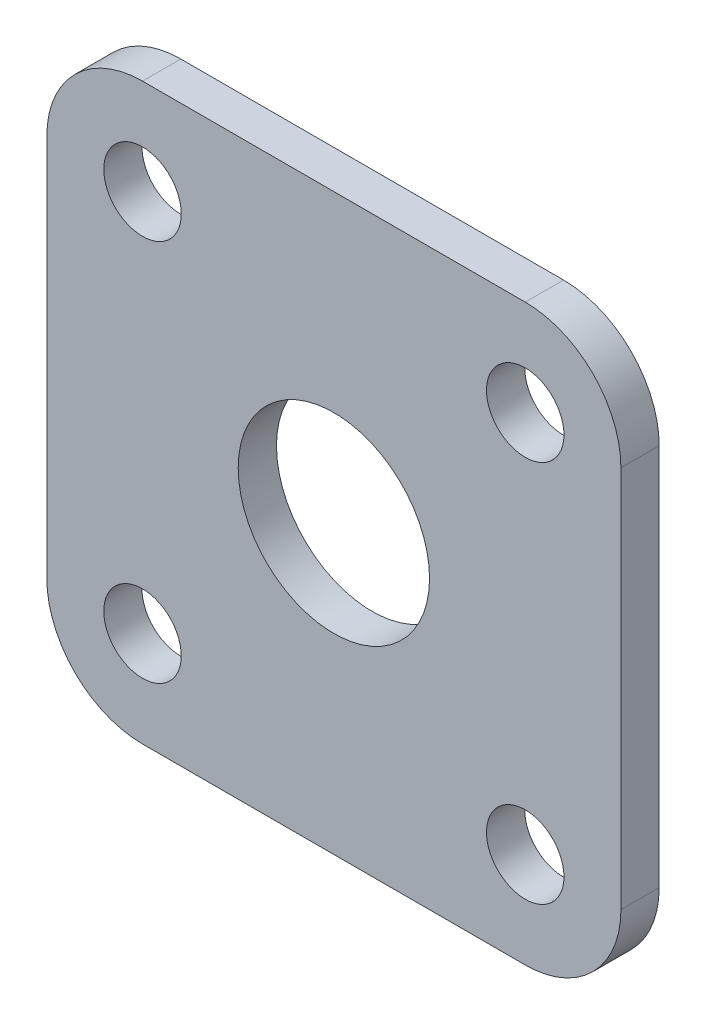
ISO-10303-21;
HEADER;
FILE_DESCRIPTION(('STEP AP214'),'2;1');
FILE_NAME('part.step','',(''),(''),'','','');
FILE_SCHEMA(('AUTOMOTIVE_DESIGN { 1 0 10303 214 1 1 1 1 }'));
ENDSEC;
DATA;
#1=APPLICATION_CONTEXT('core data for automotive mechanical design processes');
#2=APPLICATION_PROTOCOL_DEFINITION('international standard','automotive_design',2000,#1);
#3=PRODUCT_CONTEXT('',#1,'mechanical');
#4=PRODUCT('Part','Part','',(#3));
#5=PRODUCT_RELATED_PRODUCT_CATEGORY('part','',(#4));
#6=PRODUCT_DEFINITION_FORMATION('','',#4);
#7=PRODUCT_DEFINITION_CONTEXT('part definition',#1,'design');
#8=PRODUCT_DEFINITION('design','',#6,#7);
#9=PRODUCT_DEFINITION_SHAPE('','',#8);
#10=(LENGTH_UNIT() NAMED_UNIT(*) SI_UNIT(.MILLI.,.METRE.));
#11=(NAMED_UNIT(*) PLANE_ANGLE_UNIT() SI_UNIT($,.RADIAN.));
#12=(NAMED_UNIT(*) SI_UNIT($,.STERADIAN.) SOLID_ANGLE_UNIT());
#13=UNCERTAINTY_MEASURE_WITH_UNIT(LENGTH_MEASURE(1.E-05),#10,'distance_accuracy_value','');
#14=(GEOMETRIC_REPRESENTATION_CONTEXT(3) GLOBAL_UNCERTAINTY_ASSIGNED_CONTEXT((#13)) GLOBAL_UNIT_ASSIGNED_CONTEXT((#10,
#11,#12)) REPRESENTATION_CONTEXT('',''));
#15=CARTESIAN_POINT('',(0.,0.,0.));
#16=DIRECTION('',(0.,0.,1.));
#17=DIRECTION('',(1.,0.,0.));
#18=AXIS2_PLACEMENT_3D('',#15,#16,#17);
#19=CARTESIAN_POINT('',(-10.,-10.,2.));
#20=DIRECTION('',(0.,0.,1.));
#21=DIRECTION('',(1.,0.,0.));
#22=AXIS2_PLACEMENT_3D('',#19,#20,#21);
#23=PLANE('',#22);
#24=CARTESIAN_POINT('',(-10.,-10.,2.));
#25=DIRECTION('',(0.,0.,1.));
#26=DIRECTION('',(1.,0.,0.));
#27=AXIS2_PLACEMENT_3D('',#24,#25,#26);
#28=CIRCLE('',#27,2.025);
#29=CARTESIAN_POINT('',(-7.975,-10.,2.));
#30=VERTEX_POINT('',#29);
#31=EDGE_CURVE('E198',#30,#30,#28,.T.);
#32=ORIENTED_EDGE('',*,*,#31,.F.);
#33=EDGE_LOOP('',(#32));
#34=FACE_BOUND('',#33,.T.);
#35=CARTESIAN_POINT('',(10.,9.99999999999999,2.));
#36=DIRECTION('',(0.,0.,1.));
#37=DIRECTION('',(1.,0.,0.));
#38=AXIS2_PLACEMENT_3D('',#35,#36,#37);
#39=CIRCLE('',#38,2.025);
#40=CARTESIAN_POINT('',(12.025,9.99999999999999,2.));
#41=VERTEX_POINT('',#40);
#42=EDGE_CURVE('E186',#41,#41,#39,.T.);
#43=ORIENTED_EDGE('',*,*,#42,.F.);
#44=EDGE_LOOP('',(#43));
#45=FACE_BOUND('',#44,.T.);
#46=CARTESIAN_POINT('',(-10.,-10.,2.));
#47=DIRECTION('',(0.,0.,1.));
#48=DIRECTION('',(1.,0.,0.));
#49=AXIS2_PLACEMENT_3D('',#46,#47,#48);
#50=CIRCLE('',#49,5.);
#51=CARTESIAN_POINT('',(-15.,-10.,2.));
#52=VERTEX_POINT('',#51);
#53=CARTESIAN_POINT('',(-10.,-15.,2.));
#54=VERTEX_POINT('',#53);
#55=EDGE_CURVE('E149',#52,#54,#50,.T.);
#56=ORIENTED_EDGE('',*,*,#55,.T.);
#57=DIRECTION('',(1.,0.,0.));
#58=VECTOR('',#57,1.);
#59=CARTESIAN_POINT('',(-10.,-15.,2.));
#60=LINE('',#59,#58);
#61=CARTESIAN_POINT('',(10.,-15.,2.));
#62=VERTEX_POINT('',#61);
#63=EDGE_CURVE('E97',#54,#62,#60,.T.);
#64=ORIENTED_EDGE('',*,*,#63,.T.);
#65=CARTESIAN_POINT('',(10.,-10.,2.));
#66=DIRECTION('',(0.,0.,1.));
#67=DIRECTION('',(1.,0.,0.));
#68=AXIS2_PLACEMENT_3D('',#65,#66,#67);
#69=CIRCLE('',#68,5.);
#70=CARTESIAN_POINT('',(15.,-10.,2.));
#71=VERTEX_POINT('',#70);
#72=EDGE_CURVE('E164',#62,#71,#69,.T.);
#73=ORIENTED_EDGE('',*,*,#72,.T.);
#74=DIRECTION('',(0.,1.,0.));
#75=VECTOR('',#74,1.);
#76=CARTESIAN_POINT('',(15.,9.99999999999999,2.));
#77=LINE('',#76,#75);
#78=CARTESIAN_POINT('',(15.,9.99999999999999,2.));
#79=VERTEX_POINT('',#78);
#80=EDGE_CURVE('E177',#71,#79,#77,.T.);
#81=ORIENTED_EDGE('',*,*,#80,.T.);
#82=CARTESIAN_POINT('',(10.,9.99999999999999,2.));
#83=DIRECTION('',(0.,0.,1.));
#84=DIRECTION('',(-1.,0.,0.));
#85=AXIS2_PLACEMENT_3D('',#82,#83,#84);
#86=CIRCLE('',#85,5.);
#87=CARTESIAN_POINT('',(10.,15.,2.));
#88=VERTEX_POINT('',#87);
#89=EDGE_CURVE('E116',#79,#88,#86,.T.);
#90=ORIENTED_EDGE('',*,*,#89,.T.);
#91=DIRECTION('',(-1.,0.,0.));
#92=VECTOR('',#91,1.);
#93=CARTESIAN_POINT('',(-10.,15.,2.));
#94=LINE('',#93,#92);
#95=CARTESIAN_POINT('',(-10.,15.,2.));
#96=VERTEX_POINT('',#95);
#97=EDGE_CURVE('E110',#88,#96,#94,.T.);
#98=ORIENTED_EDGE('',*,*,#97,.T.);
#99=CARTESIAN_POINT('',(-10.,9.99999999999999,2.));
#100=DIRECTION('',(0.,0.,1.));
#101=DIRECTION('',(1.,0.,0.));
#102=AXIS2_PLACEMENT_3D('',#99,#100,#101);
#103=CIRCLE('',#102,5.);
#104=CARTESIAN_POINT('',(-15.,9.99999999999999,2.));
#105=VERTEX_POINT('',#104);
#106=EDGE_CURVE('E114',#96,#105,#103,.T.);
#107=ORIENTED_EDGE('',*,*,#106,.T.);
#108=DIRECTION('',(0.,-1.,0.));
#109=VECTOR('',#108,1.);
#110=CARTESIAN_POINT('',(-15.,9.99999999999999,2.));
#111=LINE('',#110,#109);
#112=EDGE_CURVE('E54',#105,#52,#111,.T.);
#113=ORIENTED_EDGE('',*,*,#112,.T.);
#114=EDGE_LOOP('',(#56,#64,#73,#81,#90,#98,#107,#113));
#115=FACE_BOUND('',#114,.T.);
#116=CARTESIAN_POINT('',(-10.,9.99999999999999,2.));
#117=DIRECTION('',(0.,0.,1.));
#118=DIRECTION('',(1.,0.,0.));
#119=AXIS2_PLACEMENT_3D('',#116,#117,#118);
#120=CIRCLE('',#119,2.025);
#121=CARTESIAN_POINT('',(-7.975,9.99999999999999,2.));
#122=VERTEX_POINT('',#121);
#123=EDGE_CURVE('E138',#122,#122,#120,.T.);
#124=ORIENTED_EDGE('',*,*,#123,.F.);
#125=EDGE_LOOP('',(#124));
#126=FACE_BOUND('',#125,.T.);
#127=CARTESIAN_POINT('',(10.,-10.,2.));
#128=DIRECTION('',(0.,0.,1.));
#129=DIRECTION('',(1.,0.,0.));
#130=AXIS2_PLACEMENT_3D('',#127,#128,#129);
#131=CIRCLE('',#130,2.025);
#132=CARTESIAN_POINT('',(12.025,-10.,2.));
#133=VERTEX_POINT('',#132);
#134=EDGE_CURVE('E192',#133,#133,#131,.T.);
#135=ORIENTED_EDGE('',*,*,#134,.F.);
#136=EDGE_LOOP('',(#135));
#137=FACE_BOUND('',#136,.T.);
#138=CARTESIAN_POINT('',(0.,0.,2.));
#139=DIRECTION('',(0.,0.,1.));
#140=DIRECTION('',(1.,0.,0.));
#141=AXIS2_PLACEMENT_3D('',#138,#139,#140);
#142=CIRCLE('',#141,5.);
#143=CARTESIAN_POINT('',(5.00000000000001,0.,2.));
#144=VERTEX_POINT('',#143);
#145=EDGE_CURVE('E204',#144,#144,#142,.T.);
#146=ORIENTED_EDGE('',*,*,#145,.F.);
#147=EDGE_LOOP('',(#146));
#148=FACE_BOUND('',#147,.T.);
#149=ADVANCED_FACE('F37',(#34,#45,#115,#126,#137,#148),#23,.T.);
#150=CARTESIAN_POINT('',(-10.,-10.,0.));
#151=DIRECTION('',(0.,0.,1.));
#152=DIRECTION('',(1.,0.,0.));
#153=AXIS2_PLACEMENT_3D('',#150,#151,#152);
#154=PLANE('',#153);
#155=CARTESIAN_POINT('',(-10.,-10.,0.));
#156=DIRECTION('',(0.,0.,1.));
#157=DIRECTION('',(1.,0.,0.));
#158=AXIS2_PLACEMENT_3D('',#155,#156,#157);
#159=CIRCLE('',#158,5.);
#160=CARTESIAN_POINT('',(-15.,-10.,0.));
#161=VERTEX_POINT('',#160);
#162=CARTESIAN_POINT('',(-10.,-15.,0.));
#163=VERTEX_POINT('',#162);
#164=EDGE_CURVE('E134',#161,#163,#159,.T.);
#165=ORIENTED_EDGE('',*,*,#164,.F.);
#166=DIRECTION('',(0.,-1.,0.));
#167=VECTOR('',#166,1.);
#168=CARTESIAN_POINT('',(-15.,9.99999999999999,0.));
#169=LINE('',#168,#167);
#170=CARTESIAN_POINT('',(-15.,9.99999999999999,0.));
#171=VERTEX_POINT('',#170);
#172=EDGE_CURVE('E89',#171,#161,#169,.T.);
#173=ORIENTED_EDGE('',*,*,#172,.F.);
#174=CARTESIAN_POINT('',(-10.,9.99999999999999,0.));
#175=DIRECTION('',(0.,0.,1.));
#176=DIRECTION('',(1.,0.,0.));
#177=AXIS2_PLACEMENT_3D('',#174,#175,#176);
#178=CIRCLE('',#177,5.);
#179=CARTESIAN_POINT('',(-10.,15.,0.));
#180=VERTEX_POINT('',#179);
#181=EDGE_CURVE('E83',#180,#171,#178,.T.);
#182=ORIENTED_EDGE('',*,*,#181,.F.);
#183=DIRECTION('',(-1.,0.,0.));
#184=VECTOR('',#183,1.);
#185=CARTESIAN_POINT('',(-10.,15.,0.));
#186=LINE('',#185,#184);
#187=CARTESIAN_POINT('',(10.,15.,0.));
#188=VERTEX_POINT('',#187);
#189=EDGE_CURVE('E124',#188,#180,#186,.T.);
#190=ORIENTED_EDGE('',*,*,#189,.F.);
#191=CARTESIAN_POINT('',(10.,9.99999999999999,0.));
#192=DIRECTION('',(0.,0.,1.));
#193=DIRECTION('',(-1.,0.,0.));
#194=AXIS2_PLACEMENT_3D('',#191,#192,#193);
#195=CIRCLE('',#194,5.);
#196=CARTESIAN_POINT('',(15.,9.99999999999999,0.));
#197=VERTEX_POINT('',#196);
#198=EDGE_CURVE('E144',#197,#188,#195,.T.);
#199=ORIENTED_EDGE('',*,*,#198,.F.);
#200=DIRECTION('',(0.,1.,0.));
#201=VECTOR('',#200,1.);
#202=CARTESIAN_POINT('',(15.,9.99999999999999,0.));
#203=LINE('',#202,#201);
#204=CARTESIAN_POINT('',(15.,-10.,0.));
#205=VERTEX_POINT('',#204);
#206=EDGE_CURVE('E142',#205,#197,#203,.T.);
#207=ORIENTED_EDGE('',*,*,#206,.F.);
#208=CARTESIAN_POINT('',(10.,-10.,0.));
#209=DIRECTION('',(0.,0.,1.));
#210=DIRECTION('',(1.,0.,0.));
#211=AXIS2_PLACEMENT_3D('',#208,#209,#210);
#212=CIRCLE('',#211,5.);
#213=CARTESIAN_POINT('',(10.,-15.,0.));
#214=VERTEX_POINT('',#213);
#215=EDGE_CURVE('E140',#214,#205,#212,.T.);
#216=ORIENTED_EDGE('',*,*,#215,.F.);
#217=DIRECTION('',(1.,0.,0.));
#218=VECTOR('',#217,1.);
#219=CARTESIAN_POINT('',(-10.,-15.,0.));
#220=LINE('',#219,#218);
#221=EDGE_CURVE('E137',#163,#214,#220,.T.);
#222=ORIENTED_EDGE('',*,*,#221,.F.);
#223=EDGE_LOOP('',(#165,#173,#182,#190,#199,#207,#216,#222));
#224=FACE_BOUND('',#223,.T.);
#225=CARTESIAN_POINT('',(-10.,9.99999999999999,0.));
#226=DIRECTION('',(0.,0.,1.));
#227=DIRECTION('',(1.,0.,0.));
#228=AXIS2_PLACEMENT_3D('',#225,#226,#227);
#229=CIRCLE('',#228,2.025);
#230=CARTESIAN_POINT('',(-7.975,9.99999999999999,0.));
#231=VERTEX_POINT('',#230);
#232=EDGE_CURVE('E183',#231,#231,#229,.T.);
#233=ORIENTED_EDGE('',*,*,#232,.T.);
#234=EDGE_LOOP('',(#233));
#235=FACE_BOUND('',#234,.T.);
#236=CARTESIAN_POINT('',(10.,9.99999999999999,0.));
#237=DIRECTION('',(0.,0.,1.));
#238=DIRECTION('',(1.,0.,0.));
#239=AXIS2_PLACEMENT_3D('',#236,#237,#238);
#240=CIRCLE('',#239,2.025);
#241=CARTESIAN_POINT('',(12.025,9.99999999999999,0.));
#242=VERTEX_POINT('',#241);
#243=EDGE_CURVE('E189',#242,#242,#240,.T.);
#244=ORIENTED_EDGE('',*,*,#243,.T.);
#245=EDGE_LOOP('',(#244));
#246=FACE_BOUND('',#245,.T.);
#247=CARTESIAN_POINT('',(10.,-10.,0.));
#248=DIRECTION('',(0.,0.,1.));
#249=DIRECTION('',(1.,0.,0.));
#250=AXIS2_PLACEMENT_3D('',#247,#248,#249);
#251=CIRCLE('',#250,2.025);
#252=CARTESIAN_POINT('',(12.025,-10.,0.));
#253=VERTEX_POINT('',#252);
#254=EDGE_CURVE('E195',#253,#253,#251,.T.);
#255=ORIENTED_EDGE('',*,*,#254,.T.);
#256=EDGE_LOOP('',(#255));
#257=FACE_BOUND('',#256,.T.);
#258=CARTESIAN_POINT('',(-10.,-10.,0.));
#259=DIRECTION('',(0.,0.,1.));
#260=DIRECTION('',(1.,0.,0.));
#261=AXIS2_PLACEMENT_3D('',#258,#259,#260);
#262=CIRCLE('',#261,2.025);
#263=CARTESIAN_POINT('',(-7.975,-10.,0.));
#264=VERTEX_POINT('',#263);
#265=EDGE_CURVE('E201',#264,#264,#262,.T.);
#266=ORIENTED_EDGE('',*,*,#265,.T.);
#267=EDGE_LOOP('',(#266));
#268=FACE_BOUND('',#267,.T.);
#269=CARTESIAN_POINT('',(0.,0.,0.));
#270=DIRECTION('',(0.,0.,1.));
#271=DIRECTION('',(1.,0.,0.));
#272=AXIS2_PLACEMENT_3D('',#269,#270,#271);
#273=CIRCLE('',#272,5.);
#274=CARTESIAN_POINT('',(5.00000000000001,0.,0.));
#275=VERTEX_POINT('',#274);
#276=EDGE_CURVE('E207',#275,#275,#273,.T.);
#277=ORIENTED_EDGE('',*,*,#276,.T.);
#278=EDGE_LOOP('',(#277));
#279=FACE_BOUND('',#278,.T.);
#280=ADVANCED_FACE('F168',(#224,#235,#246,#257,#268,#279),#154,.F.);
#281=CARTESIAN_POINT('',(-10.,-10.,2.));
#282=DIRECTION('',(0.,0.,-1.));
#283=DIRECTION('',(-1.,0.,0.));
#284=AXIS2_PLACEMENT_3D('',#281,#282,#283);
#285=CYLINDRICAL_SURFACE('',#284,5.);
#286=ORIENTED_EDGE('',*,*,#164,.T.);
#287=DIRECTION('',(0.,0.,-1.));
#288=VECTOR('',#287,1.);
#289=CARTESIAN_POINT('',(-10.,-15.,2.));
#290=LINE('',#289,#288);
#291=EDGE_CURVE('E11',#54,#163,#290,.T.);
#292=ORIENTED_EDGE('',*,*,#291,.F.);
#293=ORIENTED_EDGE('',*,*,#55,.F.);
#294=DIRECTION('',(0.,0.,-1.));
#295=VECTOR('',#294,1.);
#296=CARTESIAN_POINT('',(-15.,-10.,2.));
#297=LINE('',#296,#295);
#298=EDGE_CURVE('E130',#52,#161,#297,.T.);
#299=ORIENTED_EDGE('',*,*,#298,.T.);
#300=EDGE_LOOP('',(#286,#292,#293,#299));
#301=FACE_BOUND('',#300,.T.);
#302=ADVANCED_FACE('F39',(#301),#285,.T.);
#303=CARTESIAN_POINT('',(-10.,-15.,2.));
#304=DIRECTION('',(0.,1.,0.));
#305=DIRECTION('',(0.,0.,1.));
#306=AXIS2_PLACEMENT_3D('',#303,#304,#305);
#307=PLANE('',#306);
#308=ORIENTED_EDGE('',*,*,#221,.T.);
#309=DIRECTION('',(0.,0.,-1.));
#310=VECTOR('',#309,1.);
#311=CARTESIAN_POINT('',(10.,-15.,2.));
#312=LINE('',#311,#310);
#313=EDGE_CURVE('E46',#62,#214,#312,.T.);
#314=ORIENTED_EDGE('',*,*,#313,.F.);
#315=ORIENTED_EDGE('',*,*,#63,.F.);
#316=ORIENTED_EDGE('',*,*,#291,.T.);
#317=EDGE_LOOP('',(#308,#314,#315,#316));
#318=FACE_BOUND('',#317,.T.);
#319=ADVANCED_FACE('F241',(#318),#307,.F.);
#320=CARTESIAN_POINT('',(10.,-10.,2.));
#321=DIRECTION('',(0.,0.,-1.));
#322=DIRECTION('',(-1.,0.,0.));
#323=AXIS2_PLACEMENT_3D('',#320,#321,#322);
#324=CYLINDRICAL_SURFACE('',#323,5.);
#325=ORIENTED_EDGE('',*,*,#215,.T.);
#326=DIRECTION('',(0.,0.,-1.));
#327=VECTOR('',#326,1.);
#328=CARTESIAN_POINT('',(15.,-10.,2.));
#329=LINE('',#328,#327);
#330=EDGE_CURVE('E156',#71,#205,#329,.T.);
#331=ORIENTED_EDGE('',*,*,#330,.F.);
#332=ORIENTED_EDGE('',*,*,#72,.F.);
#333=ORIENTED_EDGE('',*,*,#313,.T.);
#334=EDGE_LOOP('',(#325,#331,#332,#333));
#335=FACE_BOUND('',#334,.T.);
#336=ADVANCED_FACE('F162',(#335),#324,.T.);
#337=CARTESIAN_POINT('',(15.,9.99999999999999,2.));
#338=DIRECTION('',(-1.,0.,0.));
#339=DIRECTION('',(0.,-1.,0.));
#340=AXIS2_PLACEMENT_3D('',#337,#338,#339);
#341=PLANE('',#340);
#342=ORIENTED_EDGE('',*,*,#206,.T.);
#343=DIRECTION('',(0.,0.,-1.));
#344=VECTOR('',#343,1.);
#345=CARTESIAN_POINT('',(15.,9.99999999999999,2.));
#346=LINE('',#345,#344);
#347=EDGE_CURVE('E153',#79,#197,#346,.T.);
#348=ORIENTED_EDGE('',*,*,#347,.F.);
#349=ORIENTED_EDGE('',*,*,#80,.F.);
#350=ORIENTED_EDGE('',*,*,#330,.T.);
#351=EDGE_LOOP('',(#342,#348,#349,#350));
#352=FACE_BOUND('',#351,.T.);
#353=ADVANCED_FACE('F173',(#352),#341,.F.);
#354=CARTESIAN_POINT('',(10.,9.99999999999999,2.));
#355=DIRECTION('',(0.,0.,-1.));
#356=DIRECTION('',(-1.,0.,0.));
#357=AXIS2_PLACEMENT_3D('',#354,#355,#356);
#358=CYLINDRICAL_SURFACE('',#357,5.);
#359=ORIENTED_EDGE('',*,*,#198,.T.);
#360=DIRECTION('',(0.,0.,-1.));
#361=VECTOR('',#360,1.);
#362=CARTESIAN_POINT('',(10.,15.,2.));
#363=LINE('',#362,#361);
#364=EDGE_CURVE('E125',#88,#188,#363,.T.);
#365=ORIENTED_EDGE('',*,*,#364,.F.);
#366=ORIENTED_EDGE('',*,*,#89,.F.);
#367=ORIENTED_EDGE('',*,*,#347,.T.);
#368=EDGE_LOOP('',(#359,#365,#366,#367));
#369=FACE_BOUND('',#368,.T.);
#370=ADVANCED_FACE('F176',(#369),#358,.T.);
#371=CARTESIAN_POINT('',(-10.,15.,2.));
#372=DIRECTION('',(0.,-1.,0.));
#373=DIRECTION('',(0.,0.,-1.));
#374=AXIS2_PLACEMENT_3D('',#371,#372,#373);
#375=PLANE('',#374);
#376=ORIENTED_EDGE('',*,*,#189,.T.);
#377=DIRECTION('',(0.,0.,-1.));
#378=VECTOR('',#377,1.);
#379=CARTESIAN_POINT('',(-10.,15.,2.));
#380=LINE('',#379,#378);
#381=EDGE_CURVE('E121',#96,#180,#380,.T.);
#382=ORIENTED_EDGE('',*,*,#381,.F.);
#383=ORIENTED_EDGE('',*,*,#97,.F.);
#384=ORIENTED_EDGE('',*,*,#364,.T.);
#385=EDGE_LOOP('',(#376,#382,#383,#384));
#386=FACE_BOUND('',#385,.T.);
#387=ADVANCED_FACE('F122',(#386),#375,.F.);
#388=CARTESIAN_POINT('',(-10.,9.99999999999999,2.));
#389=DIRECTION('',(0.,0.,-1.));
#390=DIRECTION('',(-1.,0.,0.));
#391=AXIS2_PLACEMENT_3D('',#388,#389,#390);
#392=CYLINDRICAL_SURFACE('',#391,5.);
#393=ORIENTED_EDGE('',*,*,#181,.T.);
#394=DIRECTION('',(0.,0.,-1.));
#395=VECTOR('',#394,1.);
#396=CARTESIAN_POINT('',(-15.,9.99999999999999,2.));
#397=LINE('',#396,#395);
#398=EDGE_CURVE('E126',#105,#171,#397,.T.);
#399=ORIENTED_EDGE('',*,*,#398,.F.);
#400=ORIENTED_EDGE('',*,*,#106,.F.);
#401=ORIENTED_EDGE('',*,*,#381,.T.);
#402=EDGE_LOOP('',(#393,#399,#400,#401));
#403=FACE_BOUND('',#402,.T.);
#404=ADVANCED_FACE('F128',(#403),#392,.T.);
#405=CARTESIAN_POINT('',(-15.,9.99999999999999,2.));
#406=DIRECTION('',(1.,0.,0.));
#407=DIRECTION('',(0.,1.,0.));
#408=AXIS2_PLACEMENT_3D('',#405,#406,#407);
#409=PLANE('',#408);
#410=ORIENTED_EDGE('',*,*,#172,.T.);
#411=ORIENTED_EDGE('',*,*,#298,.F.);
#412=ORIENTED_EDGE('',*,*,#112,.F.);
#413=ORIENTED_EDGE('',*,*,#398,.T.);
#414=EDGE_LOOP('',(#410,#411,#412,#413));
#415=FACE_BOUND('',#414,.T.);
#416=ADVANCED_FACE('F229',(#415),#409,.F.);
#417=CARTESIAN_POINT('',(-10.,9.99999999999999,2.));
#418=DIRECTION('',(0.,0.,-1.));
#419=DIRECTION('',(-1.,0.,0.));
#420=AXIS2_PLACEMENT_3D('',#417,#418,#419);
#421=CYLINDRICAL_SURFACE('',#420,2.025);
#422=ORIENTED_EDGE('',*,*,#123,.T.);
#423=EDGE_LOOP('',(#422));
#424=FACE_BOUND('',#423,.T.);
#425=ORIENTED_EDGE('',*,*,#232,.F.);
#426=EDGE_LOOP('',(#425));
#427=FACE_BOUND('',#426,.T.);
#428=ADVANCED_FACE('F226',(#424,#427),#421,.F.);
#429=CARTESIAN_POINT('',(10.,9.99999999999999,2.));
#430=DIRECTION('',(0.,0.,-1.));
#431=DIRECTION('',(-1.,0.,0.));
#432=AXIS2_PLACEMENT_3D('',#429,#430,#431);
#433=CYLINDRICAL_SURFACE('',#432,2.025);
#434=ORIENTED_EDGE('',*,*,#42,.T.);
#435=EDGE_LOOP('',(#434));
#436=FACE_BOUND('',#435,.T.);
#437=ORIENTED_EDGE('',*,*,#243,.F.);
#438=EDGE_LOOP('',(#437));
#439=FACE_BOUND('',#438,.T.);
#440=ADVANCED_FACE('F305',(#436,#439),#433,.F.);
#441=CARTESIAN_POINT('',(10.,-10.,2.));
#442=DIRECTION('',(0.,0.,-1.));
#443=DIRECTION('',(-1.,0.,0.));
#444=AXIS2_PLACEMENT_3D('',#441,#442,#443);
#445=CYLINDRICAL_SURFACE('',#444,2.025);
#446=ORIENTED_EDGE('',*,*,#134,.T.);
#447=EDGE_LOOP('',(#446));
#448=FACE_BOUND('',#447,.T.);
#449=ORIENTED_EDGE('',*,*,#254,.F.);
#450=EDGE_LOOP('',(#449));
#451=FACE_BOUND('',#450,.T.);
#452=ADVANCED_FACE('F313',(#448,#451),#445,.F.);
#453=CARTESIAN_POINT('',(-10.,-10.,2.));
#454=DIRECTION('',(0.,0.,-1.));
#455=DIRECTION('',(-1.,0.,0.));
#456=AXIS2_PLACEMENT_3D('',#453,#454,#455);
#457=CYLINDRICAL_SURFACE('',#456,2.025);
#458=ORIENTED_EDGE('',*,*,#31,.T.);
#459=EDGE_LOOP('',(#458));
#460=FACE_BOUND('',#459,.T.);
#461=ORIENTED_EDGE('',*,*,#265,.F.);
#462=EDGE_LOOP('',(#461));
#463=FACE_BOUND('',#462,.T.);
#464=ADVANCED_FACE('F321',(#460,#463),#457,.F.);
#465=CARTESIAN_POINT('',(0.,0.,2.));
#466=DIRECTION('',(0.,0.,-1.));
#467=DIRECTION('',(-1.,0.,0.));
#468=AXIS2_PLACEMENT_3D('',#465,#466,#467);
#469=CYLINDRICAL_SURFACE('',#468,5.);
#470=ORIENTED_EDGE('',*,*,#145,.T.);
#471=EDGE_LOOP('',(#470));
#472=FACE_BOUND('',#471,.T.);
#473=ORIENTED_EDGE('',*,*,#276,.F.);
#474=EDGE_LOOP('',(#473));
#475=FACE_BOUND('',#474,.T.);
#476=ADVANCED_FACE('F213',(#472,#475),#469,.F.);
#477=CLOSED_SHELL('',(#149,#280,#302,#319,#336,#353,#370,#387,#404,#416,#428,#440,#452,#464,#476));
#478=MANIFOLD_SOLID_BREP('B2',#477);
#479=ADVANCED_BREP_SHAPE_REPRESENTATION('',(#18,#478),#14);
#480=SHAPE_DEFINITION_REPRESENTATION(#9,#479);
ENDSEC;
END-ISO-10303-21;
